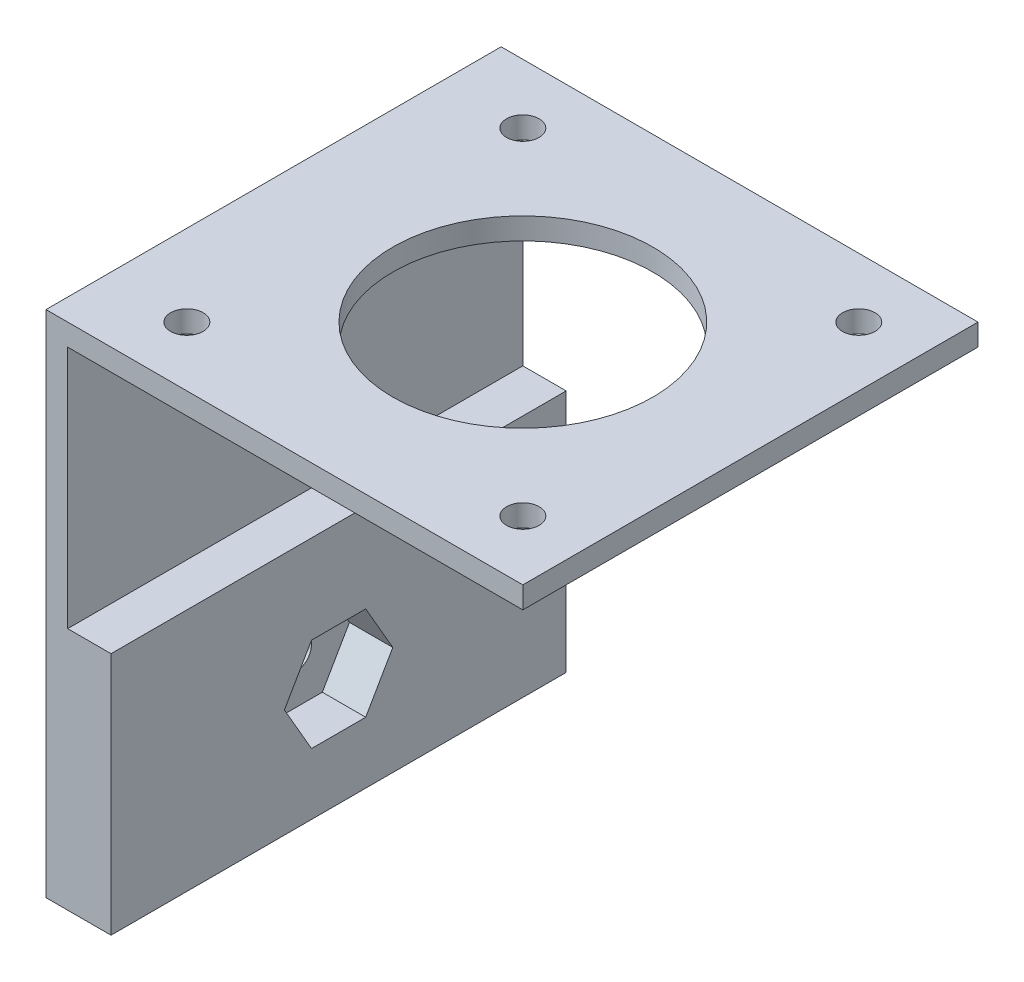
ISO-10303-21;
HEADER;
FILE_DESCRIPTION(('STEP AP214'),'2;1');
FILE_NAME('part.step','',(''),(''),'','','');
FILE_SCHEMA(('AUTOMOTIVE_DESIGN { 1 0 10303 214 1 1 1 1 }'));
ENDSEC;
DATA;
#1=APPLICATION_CONTEXT('core data for automotive mechanical design processes');
#2=APPLICATION_PROTOCOL_DEFINITION('international standard','automotive_design',2000,#1);
#3=PRODUCT_CONTEXT('',#1,'mechanical');
#4=PRODUCT('Part','Part','',(#3));
#5=PRODUCT_RELATED_PRODUCT_CATEGORY('part','',(#4));
#6=PRODUCT_DEFINITION_FORMATION('','',#4);
#7=PRODUCT_DEFINITION_CONTEXT('part definition',#1,'design');
#8=PRODUCT_DEFINITION('design','',#6,#7);
#9=PRODUCT_DEFINITION_SHAPE('','',#8);
#10=(LENGTH_UNIT() NAMED_UNIT(*) SI_UNIT(.MILLI.,.METRE.));
#11=(NAMED_UNIT(*) PLANE_ANGLE_UNIT() SI_UNIT($,.RADIAN.));
#12=(NAMED_UNIT(*) SI_UNIT($,.STERADIAN.) SOLID_ANGLE_UNIT());
#13=UNCERTAINTY_MEASURE_WITH_UNIT(LENGTH_MEASURE(1.E-05),#10,'distance_accuracy_value','');
#14=(GEOMETRIC_REPRESENTATION_CONTEXT(3) GLOBAL_UNCERTAINTY_ASSIGNED_CONTEXT((#13)) GLOBAL_UNIT_ASSIGNED_CONTEXT((#10,
#11,#12)) REPRESENTATION_CONTEXT('',''));
#15=CARTESIAN_POINT('',(0.,0.,0.));
#16=DIRECTION('',(0.,0.,1.));
#17=DIRECTION('',(1.,0.,0.));
#18=AXIS2_PLACEMENT_3D('',#15,#16,#17);
#19=CARTESIAN_POINT('',(0.,-45.,0.));
#20=DIRECTION('',(-1.,0.,0.));
#21=DIRECTION('',(0.,0.,1.));
#22=AXIS2_PLACEMENT_3D('',#19,#20,#21);
#23=PLANE('',#22);
#24=DIRECTION('',(0.,0.,1.));
#25=VECTOR('',#24,1.);
#26=CARTESIAN_POINT('',(0.,-22.5,0.));
#27=LINE('',#26,#25);
#28=CARTESIAN_POINT('',(0.,-22.5,-42.));
#29=VERTEX_POINT('',#28);
#30=CARTESIAN_POINT('',(0.,-22.5,0.));
#31=VERTEX_POINT('',#30);
#32=EDGE_CURVE('E209',#29,#31,#27,.T.);
#33=ORIENTED_EDGE('',*,*,#32,.F.);
#34=DIRECTION('',(0.,1.,0.));
#35=VECTOR('',#34,1.);
#36=CARTESIAN_POINT('',(0.,-45.,-42.));
#37=LINE('',#36,#35);
#38=CARTESIAN_POINT('',(0.,0.,-42.));
#39=VERTEX_POINT('',#38);
#40=EDGE_CURVE('E66',#29,#39,#37,.T.);
#41=ORIENTED_EDGE('',*,*,#40,.T.);
#42=DIRECTION('',(0.,0.,1.));
#43=VECTOR('',#42,1.);
#44=CARTESIAN_POINT('',(0.,0.,0.));
#45=LINE('',#44,#43);
#46=CARTESIAN_POINT('',(0.,0.,0.));
#47=VERTEX_POINT('',#46);
#48=EDGE_CURVE('E245',#39,#47,#45,.T.);
#49=ORIENTED_EDGE('',*,*,#48,.T.);
#50=DIRECTION('',(0.,1.,0.));
#51=VECTOR('',#50,1.);
#52=CARTESIAN_POINT('',(0.,-45.,0.));
#53=LINE('',#52,#51);
#54=EDGE_CURVE('E257',#31,#47,#53,.T.);
#55=ORIENTED_EDGE('',*,*,#54,.F.);
#56=EDGE_LOOP('',(#33,#41,#49,#55));
#57=FACE_BOUND('',#56,.T.);
#58=ADVANCED_FACE('F41',(#57),#23,.F.);
#59=CARTESIAN_POINT('',(0.,2.,0.));
#60=DIRECTION('',(0.,0.,-1.));
#61=DIRECTION('',(-1.,0.,0.));
#62=AXIS2_PLACEMENT_3D('',#59,#60,#61);
#63=PLANE('',#62);
#64=DIRECTION('',(0.,1.,0.));
#65=VECTOR('',#64,1.);
#66=CARTESIAN_POINT('',(-2.,2.,0.));
#67=LINE('',#66,#65);
#68=CARTESIAN_POINT('',(-2.,-45.,0.));
#69=VERTEX_POINT('',#68);
#70=CARTESIAN_POINT('',(-2.,2.,0.));
#71=VERTEX_POINT('',#70);
#72=EDGE_CURVE('E267',#69,#71,#67,.T.);
#73=ORIENTED_EDGE('',*,*,#72,.F.);
#74=DIRECTION('',(-1.,0.,0.));
#75=VECTOR('',#74,1.);
#76=CARTESIAN_POINT('',(-2.,-45.,0.));
#77=LINE('',#76,#75);
#78=CARTESIAN_POINT('',(4.,-45.,0.));
#79=VERTEX_POINT('',#78);
#80=EDGE_CURVE('E253',#79,#69,#77,.T.);
#81=ORIENTED_EDGE('',*,*,#80,.F.);
#82=DIRECTION('',(0.,-1.,0.));
#83=VECTOR('',#82,1.);
#84=CARTESIAN_POINT('',(4.,0.,0.));
#85=LINE('',#84,#83);
#86=CARTESIAN_POINT('',(4.,-22.5,0.));
#87=VERTEX_POINT('',#86);
#88=EDGE_CURVE('E228',#87,#79,#85,.T.);
#89=ORIENTED_EDGE('',*,*,#88,.F.);
#90=DIRECTION('',(-1.,0.,0.));
#91=VECTOR('',#90,1.);
#92=CARTESIAN_POINT('',(4.,-22.5,0.));
#93=LINE('',#92,#91);
#94=EDGE_CURVE('E236',#87,#31,#93,.T.);
#95=ORIENTED_EDGE('',*,*,#94,.T.);
#96=ORIENTED_EDGE('',*,*,#54,.T.);
#97=DIRECTION('',(1.,0.,0.));
#98=VECTOR('',#97,1.);
#99=CARTESIAN_POINT('',(0.,0.,0.));
#100=LINE('',#99,#98);
#101=CARTESIAN_POINT('',(42.,0.,0.));
#102=VERTEX_POINT('',#101);
#103=EDGE_CURVE('E312',#47,#102,#100,.T.);
#104=ORIENTED_EDGE('',*,*,#103,.T.);
#105=DIRECTION('',(0.,-1.,0.));
#106=VECTOR('',#105,1.);
#107=CARTESIAN_POINT('',(42.,2.,0.));
#108=LINE('',#107,#106);
#109=CARTESIAN_POINT('',(42.,2.,0.));
#110=VERTEX_POINT('',#109);
#111=EDGE_CURVE('E11',#110,#102,#108,.T.);
#112=ORIENTED_EDGE('',*,*,#111,.F.);
#113=DIRECTION('',(1.,0.,0.));
#114=VECTOR('',#113,1.);
#115=CARTESIAN_POINT('',(0.,2.,0.));
#116=LINE('',#115,#114);
#117=EDGE_CURVE('E316',#71,#110,#116,.T.);
#118=ORIENTED_EDGE('',*,*,#117,.F.);
#119=EDGE_LOOP('',(#73,#81,#89,#95,#96,#104,#112,#118));
#120=FACE_BOUND('',#119,.T.);
#121=ADVANCED_FACE('F43',(#120),#63,.F.);
#122=CARTESIAN_POINT('',(42.,2.,0.));
#123=DIRECTION('',(-1.,0.,0.));
#124=DIRECTION('',(0.,0.,1.));
#125=AXIS2_PLACEMENT_3D('',#122,#123,#124);
#126=PLANE('',#125);
#127=DIRECTION('',(0.,0.,-1.));
#128=VECTOR('',#127,1.);
#129=CARTESIAN_POINT('',(42.,0.,0.));
#130=LINE('',#129,#128);
#131=CARTESIAN_POINT('',(42.,0.,-42.));
#132=VERTEX_POINT('',#131);
#133=EDGE_CURVE('E328',#102,#132,#130,.T.);
#134=ORIENTED_EDGE('',*,*,#133,.T.);
#135=DIRECTION('',(0.,-1.,0.));
#136=VECTOR('',#135,1.);
#137=CARTESIAN_POINT('',(42.,2.,-42.));
#138=LINE('',#137,#136);
#139=CARTESIAN_POINT('',(42.,2.,-42.));
#140=VERTEX_POINT('',#139);
#141=EDGE_CURVE('E51',#140,#132,#138,.T.);
#142=ORIENTED_EDGE('',*,*,#141,.F.);
#143=DIRECTION('',(0.,0.,-1.));
#144=VECTOR('',#143,1.);
#145=CARTESIAN_POINT('',(42.,2.,0.));
#146=LINE('',#145,#144);
#147=EDGE_CURVE('E319',#110,#140,#146,.T.);
#148=ORIENTED_EDGE('',*,*,#147,.F.);
#149=ORIENTED_EDGE('',*,*,#111,.T.);
#150=EDGE_LOOP('',(#134,#142,#148,#149));
#151=FACE_BOUND('',#150,.T.);
#152=ADVANCED_FACE('F370',(#151),#126,.F.);
#153=CARTESIAN_POINT('',(0.,2.,-42.));
#154=DIRECTION('',(0.,0.,1.));
#155=DIRECTION('',(1.,0.,0.));
#156=AXIS2_PLACEMENT_3D('',#153,#154,#155);
#157=PLANE('',#156);
#158=DIRECTION('',(-1.,0.,0.));
#159=VECTOR('',#158,1.);
#160=CARTESIAN_POINT('',(0.,0.,-42.));
#161=LINE('',#160,#159);
#162=EDGE_CURVE('E320',#132,#39,#161,.T.);
#163=ORIENTED_EDGE('',*,*,#162,.T.);
#164=ORIENTED_EDGE('',*,*,#40,.F.);
#165=DIRECTION('',(-1.,0.,0.));
#166=VECTOR('',#165,1.);
#167=CARTESIAN_POINT('',(4.,-22.5,-42.));
#168=LINE('',#167,#166);
#169=CARTESIAN_POINT('',(4.,-22.5,-42.));
#170=VERTEX_POINT('',#169);
#171=EDGE_CURVE('E242',#170,#29,#168,.T.);
#172=ORIENTED_EDGE('',*,*,#171,.F.);
#173=DIRECTION('',(0.,1.,0.));
#174=VECTOR('',#173,1.);
#175=CARTESIAN_POINT('',(4.,0.,-42.));
#176=LINE('',#175,#174);
#177=CARTESIAN_POINT('',(4.,-45.,-42.));
#178=VERTEX_POINT('',#177);
#179=EDGE_CURVE('E221',#178,#170,#176,.T.);
#180=ORIENTED_EDGE('',*,*,#179,.F.);
#181=DIRECTION('',(1.,0.,0.));
#182=VECTOR('',#181,1.);
#183=CARTESIAN_POINT('',(0.,-45.,-42.));
#184=LINE('',#183,#182);
#185=CARTESIAN_POINT('',(-2.,-45.,-42.));
#186=VERTEX_POINT('',#185);
#187=EDGE_CURVE('E250',#186,#178,#184,.T.);
#188=ORIENTED_EDGE('',*,*,#187,.F.);
#189=DIRECTION('',(0.,-1.,0.));
#190=VECTOR('',#189,1.);
#191=CARTESIAN_POINT('',(-2.,0.,-42.));
#192=LINE('',#191,#190);
#193=CARTESIAN_POINT('',(-2.,2.,-42.));
#194=VERTEX_POINT('',#193);
#195=EDGE_CURVE('E264',#194,#186,#192,.T.);
#196=ORIENTED_EDGE('',*,*,#195,.F.);
#197=DIRECTION('',(-1.,0.,0.));
#198=VECTOR('',#197,1.);
#199=CARTESIAN_POINT('',(0.,2.,-42.));
#200=LINE('',#199,#198);
#201=EDGE_CURVE('E323',#140,#194,#200,.T.);
#202=ORIENTED_EDGE('',*,*,#201,.F.);
#203=ORIENTED_EDGE('',*,*,#141,.T.);
#204=EDGE_LOOP('',(#163,#164,#172,#180,#188,#196,#202,#203));
#205=FACE_BOUND('',#204,.T.);
#206=ADVANCED_FACE('F340',(#205),#157,.F.);
#207=CARTESIAN_POINT('',(0.,2.,0.));
#208=DIRECTION('',(0.,-1.,0.));
#209=DIRECTION('',(0.,0.,-1.));
#210=AXIS2_PLACEMENT_3D('',#207,#208,#209);
#211=PLANE('',#210);
#212=CARTESIAN_POINT('',(5.5,2.,-36.5));
#213=DIRECTION('',(0.,1.,0.));
#214=DIRECTION('',(0.,0.,1.));
#215=AXIS2_PLACEMENT_3D('',#212,#213,#214);
#216=CIRCLE('',#215,1.5);
#217=CARTESIAN_POINT('',(5.5,2.,-35.));
#218=VERTEX_POINT('',#217);
#219=EDGE_CURVE('E275',#218,#218,#216,.T.);
#220=ORIENTED_EDGE('',*,*,#219,.F.);
#221=EDGE_LOOP('',(#220));
#222=FACE_BOUND('',#221,.T.);
#223=CARTESIAN_POINT('',(5.5,2.,-5.5));
#224=DIRECTION('',(0.,1.,0.));
#225=DIRECTION('',(0.,0.,1.));
#226=AXIS2_PLACEMENT_3D('',#223,#224,#225);
#227=CIRCLE('',#226,1.5);
#228=CARTESIAN_POINT('',(5.5,2.,-4.));
#229=VERTEX_POINT('',#228);
#230=EDGE_CURVE('E297',#229,#229,#227,.T.);
#231=ORIENTED_EDGE('',*,*,#230,.F.);
#232=EDGE_LOOP('',(#231));
#233=FACE_BOUND('',#232,.T.);
#234=CARTESIAN_POINT('',(36.5,2.,-5.50000000000001));
#235=DIRECTION('',(0.,1.,0.));
#236=DIRECTION('',(0.,0.,1.));
#237=AXIS2_PLACEMENT_3D('',#234,#235,#236);
#238=CIRCLE('',#237,1.5);
#239=CARTESIAN_POINT('',(36.5,2.,-4.));
#240=VERTEX_POINT('',#239);
#241=EDGE_CURVE('E289',#240,#240,#238,.T.);
#242=ORIENTED_EDGE('',*,*,#241,.F.);
#243=EDGE_LOOP('',(#242));
#244=FACE_BOUND('',#243,.T.);
#245=CARTESIAN_POINT('',(36.5,2.,-36.5));
#246=DIRECTION('',(0.,1.,0.));
#247=DIRECTION('',(0.,0.,1.));
#248=AXIS2_PLACEMENT_3D('',#245,#246,#247);
#249=CIRCLE('',#248,1.5);
#250=CARTESIAN_POINT('',(36.5,2.,-35.));
#251=VERTEX_POINT('',#250);
#252=EDGE_CURVE('E281',#251,#251,#249,.T.);
#253=ORIENTED_EDGE('',*,*,#252,.F.);
#254=EDGE_LOOP('',(#253));
#255=FACE_BOUND('',#254,.T.);
#256=CARTESIAN_POINT('',(21.,2.,-21.));
#257=DIRECTION('',(0.,1.,0.));
#258=DIRECTION('',(0.,0.,1.));
#259=AXIS2_PLACEMENT_3D('',#256,#257,#258);
#260=CIRCLE('',#259,12.);
#261=CARTESIAN_POINT('',(21.,2.,-9.00000000000001));
#262=VERTEX_POINT('',#261);
#263=EDGE_CURVE('E280',#262,#262,#260,.T.);
#264=ORIENTED_EDGE('',*,*,#263,.F.);
#265=EDGE_LOOP('',(#264));
#266=FACE_BOUND('',#265,.T.);
#267=ORIENTED_EDGE('',*,*,#201,.T.);
#268=DIRECTION('',(0.,0.,-1.));
#269=VECTOR('',#268,1.);
#270=CARTESIAN_POINT('',(-2.,2.,-42.));
#271=LINE('',#270,#269);
#272=EDGE_CURVE('E271',#71,#194,#271,.T.);
#273=ORIENTED_EDGE('',*,*,#272,.F.);
#274=ORIENTED_EDGE('',*,*,#117,.T.);
#275=ORIENTED_EDGE('',*,*,#147,.T.);
#276=EDGE_LOOP('',(#267,#273,#274,#275));
#277=FACE_BOUND('',#276,.T.);
#278=ADVANCED_FACE('F369',(#222,#233,#244,#255,#266,#277),#211,.F.);
#279=CARTESIAN_POINT('',(0.,0.,0.));
#280=DIRECTION('',(0.,-1.,0.));
#281=DIRECTION('',(0.,0.,-1.));
#282=AXIS2_PLACEMENT_3D('',#279,#280,#281);
#283=PLANE('',#282);
#284=ORIENTED_EDGE('',*,*,#48,.F.);
#285=ORIENTED_EDGE('',*,*,#162,.F.);
#286=ORIENTED_EDGE('',*,*,#133,.F.);
#287=ORIENTED_EDGE('',*,*,#103,.F.);
#288=EDGE_LOOP('',(#284,#285,#286,#287));
#289=FACE_BOUND('',#288,.T.);
#290=CARTESIAN_POINT('',(5.5,0.,-36.5));
#291=DIRECTION('',(0.,1.,0.));
#292=DIRECTION('',(0.,0.,1.));
#293=AXIS2_PLACEMENT_3D('',#290,#291,#292);
#294=CIRCLE('',#293,1.5);
#295=CARTESIAN_POINT('',(5.5,0.,-35.));
#296=VERTEX_POINT('',#295);
#297=EDGE_CURVE('E301',#296,#296,#294,.T.);
#298=ORIENTED_EDGE('',*,*,#297,.T.);
#299=EDGE_LOOP('',(#298));
#300=FACE_BOUND('',#299,.T.);
#301=CARTESIAN_POINT('',(5.5,0.,-5.5));
#302=DIRECTION('',(0.,1.,0.));
#303=DIRECTION('',(0.,0.,1.));
#304=AXIS2_PLACEMENT_3D('',#301,#302,#303);
#305=CIRCLE('',#304,1.5);
#306=CARTESIAN_POINT('',(5.5,0.,-4.));
#307=VERTEX_POINT('',#306);
#308=EDGE_CURVE('E293',#307,#307,#305,.T.);
#309=ORIENTED_EDGE('',*,*,#308,.T.);
#310=EDGE_LOOP('',(#309));
#311=FACE_BOUND('',#310,.T.);
#312=CARTESIAN_POINT('',(36.5,0.,-5.50000000000001));
#313=DIRECTION('',(0.,1.,0.));
#314=DIRECTION('',(0.,0.,1.));
#315=AXIS2_PLACEMENT_3D('',#312,#313,#314);
#316=CIRCLE('',#315,1.5);
#317=CARTESIAN_POINT('',(36.5,0.,-4.));
#318=VERTEX_POINT('',#317);
#319=EDGE_CURVE('E285',#318,#318,#316,.T.);
#320=ORIENTED_EDGE('',*,*,#319,.T.);
#321=EDGE_LOOP('',(#320));
#322=FACE_BOUND('',#321,.T.);
#323=CARTESIAN_POINT('',(36.5,0.,-36.5));
#324=DIRECTION('',(0.,1.,0.));
#325=DIRECTION('',(0.,0.,1.));
#326=AXIS2_PLACEMENT_3D('',#323,#324,#325);
#327=CIRCLE('',#326,1.5);
#328=CARTESIAN_POINT('',(36.5,0.,-35.));
#329=VERTEX_POINT('',#328);
#330=EDGE_CURVE('E276',#329,#329,#327,.T.);
#331=ORIENTED_EDGE('',*,*,#330,.T.);
#332=EDGE_LOOP('',(#331));
#333=FACE_BOUND('',#332,.T.);
#334=CARTESIAN_POINT('',(21.,0.,-21.));
#335=DIRECTION('',(0.,1.,0.));
#336=DIRECTION('',(0.,0.,1.));
#337=AXIS2_PLACEMENT_3D('',#334,#335,#336);
#338=CIRCLE('',#337,12.);
#339=CARTESIAN_POINT('',(21.,0.,-9.00000000000001));
#340=VERTEX_POINT('',#339);
#341=EDGE_CURVE('E308',#340,#340,#338,.T.);
#342=ORIENTED_EDGE('',*,*,#341,.T.);
#343=EDGE_LOOP('',(#342));
#344=FACE_BOUND('',#343,.T.);
#345=ADVANCED_FACE('F346',(#289,#300,#311,#322,#333,#344),#283,.T.);
#346=CARTESIAN_POINT('',(21.,0.,-21.));
#347=DIRECTION('',(0.,1.,0.));
#348=DIRECTION('',(0.,0.,1.));
#349=AXIS2_PLACEMENT_3D('',#346,#347,#348);
#350=CYLINDRICAL_SURFACE('',#349,12.);
#351=ORIENTED_EDGE('',*,*,#341,.F.);
#352=EDGE_LOOP('',(#351));
#353=FACE_BOUND('',#352,.T.);
#354=ORIENTED_EDGE('',*,*,#263,.T.);
#355=EDGE_LOOP('',(#354));
#356=FACE_BOUND('',#355,.T.);
#357=ADVANCED_FACE('F392',(#353,#356),#350,.F.);
#358=CARTESIAN_POINT('',(36.5,0.,-36.5));
#359=DIRECTION('',(0.,1.,0.));
#360=DIRECTION('',(0.,0.,1.));
#361=AXIS2_PLACEMENT_3D('',#358,#359,#360);
#362=CYLINDRICAL_SURFACE('',#361,1.5);
#363=ORIENTED_EDGE('',*,*,#330,.F.);
#364=EDGE_LOOP('',(#363));
#365=FACE_BOUND('',#364,.T.);
#366=ORIENTED_EDGE('',*,*,#252,.T.);
#367=EDGE_LOOP('',(#366));
#368=FACE_BOUND('',#367,.T.);
#369=ADVANCED_FACE('F388',(#365,#368),#362,.F.);
#370=CARTESIAN_POINT('',(36.5,0.,-5.50000000000001));
#371=DIRECTION('',(0.,1.,0.));
#372=DIRECTION('',(0.,0.,1.));
#373=AXIS2_PLACEMENT_3D('',#370,#371,#372);
#374=CYLINDRICAL_SURFACE('',#373,1.5);
#375=ORIENTED_EDGE('',*,*,#319,.F.);
#376=EDGE_LOOP('',(#375));
#377=FACE_BOUND('',#376,.T.);
#378=ORIENTED_EDGE('',*,*,#241,.T.);
#379=EDGE_LOOP('',(#378));
#380=FACE_BOUND('',#379,.T.);
#381=ADVANCED_FACE('F391',(#377,#380),#374,.F.);
#382=CARTESIAN_POINT('',(5.5,0.,-5.5));
#383=DIRECTION('',(0.,1.,0.));
#384=DIRECTION('',(0.,0.,1.));
#385=AXIS2_PLACEMENT_3D('',#382,#383,#384);
#386=CYLINDRICAL_SURFACE('',#385,1.5);
#387=ORIENTED_EDGE('',*,*,#308,.F.);
#388=EDGE_LOOP('',(#387));
#389=FACE_BOUND('',#388,.T.);
#390=ORIENTED_EDGE('',*,*,#230,.T.);
#391=EDGE_LOOP('',(#390));
#392=FACE_BOUND('',#391,.T.);
#393=ADVANCED_FACE('F396',(#389,#392),#386,.F.);
#394=CARTESIAN_POINT('',(5.5,0.,-36.5));
#395=DIRECTION('',(0.,1.,0.));
#396=DIRECTION('',(0.,0.,1.));
#397=AXIS2_PLACEMENT_3D('',#394,#395,#396);
#398=CYLINDRICAL_SURFACE('',#397,1.5);
#399=ORIENTED_EDGE('',*,*,#297,.F.);
#400=EDGE_LOOP('',(#399));
#401=FACE_BOUND('',#400,.T.);
#402=ORIENTED_EDGE('',*,*,#219,.T.);
#403=EDGE_LOOP('',(#402));
#404=FACE_BOUND('',#403,.T.);
#405=ADVANCED_FACE('F386',(#401,#404),#398,.F.);
#406=CARTESIAN_POINT('',(-2.,0.,0.));
#407=DIRECTION('',(1.,0.,0.));
#408=DIRECTION('',(0.,0.,-1.));
#409=AXIS2_PLACEMENT_3D('',#406,#407,#408);
#410=PLANE('',#409);
#411=CARTESIAN_POINT('',(-2.,-35.,-21.));
#412=DIRECTION('',(1.,0.,0.));
#413=DIRECTION('',(0.,0.,-1.));
#414=AXIS2_PLACEMENT_3D('',#411,#412,#413);
#415=CIRCLE('',#414,1.5);
#416=CARTESIAN_POINT('',(-2.,-35.,-22.5));
#417=VERTEX_POINT('',#416);
#418=EDGE_CURVE('E45',#417,#417,#415,.T.);
#419=ORIENTED_EDGE('',*,*,#418,.T.);
#420=EDGE_LOOP('',(#419));
#421=FACE_BOUND('',#420,.T.);
#422=ORIENTED_EDGE('',*,*,#195,.T.);
#423=DIRECTION('',(0.,0.,-1.));
#424=VECTOR('',#423,1.);
#425=CARTESIAN_POINT('',(-2.,-45.,-42.));
#426=LINE('',#425,#424);
#427=EDGE_CURVE('E246',#69,#186,#426,.T.);
#428=ORIENTED_EDGE('',*,*,#427,.F.);
#429=ORIENTED_EDGE('',*,*,#72,.T.);
#430=ORIENTED_EDGE('',*,*,#272,.T.);
#431=EDGE_LOOP('',(#422,#428,#429,#430));
#432=FACE_BOUND('',#431,.T.);
#433=ADVANCED_FACE('F366',(#421,#432),#410,.F.);
#434=CARTESIAN_POINT('',(0.,-45.,0.));
#435=DIRECTION('',(0.,1.,0.));
#436=DIRECTION('',(0.,0.,1.));
#437=AXIS2_PLACEMENT_3D('',#434,#435,#436);
#438=PLANE('',#437);
#439=ORIENTED_EDGE('',*,*,#427,.T.);
#440=ORIENTED_EDGE('',*,*,#187,.T.);
#441=DIRECTION('',(0.,0.,-1.));
#442=VECTOR('',#441,1.);
#443=CARTESIAN_POINT('',(4.,-45.,0.));
#444=LINE('',#443,#442);
#445=EDGE_CURVE('E232',#79,#178,#444,.T.);
#446=ORIENTED_EDGE('',*,*,#445,.F.);
#447=ORIENTED_EDGE('',*,*,#80,.T.);
#448=EDGE_LOOP('',(#439,#440,#446,#447));
#449=FACE_BOUND('',#448,.T.);
#450=ADVANCED_FACE('F363',(#449),#438,.F.);
#451=CARTESIAN_POINT('',(4.,-22.5,0.));
#452=DIRECTION('',(0.,-1.,0.));
#453=DIRECTION('',(0.,0.,-1.));
#454=AXIS2_PLACEMENT_3D('',#451,#452,#453);
#455=PLANE('',#454);
#456=ORIENTED_EDGE('',*,*,#32,.T.);
#457=ORIENTED_EDGE('',*,*,#94,.F.);
#458=DIRECTION('',(0.,0.,1.));
#459=VECTOR('',#458,1.);
#460=CARTESIAN_POINT('',(4.,-22.5,0.));
#461=LINE('',#460,#459);
#462=EDGE_CURVE('E225',#170,#87,#461,.T.);
#463=ORIENTED_EDGE('',*,*,#462,.F.);
#464=ORIENTED_EDGE('',*,*,#171,.T.);
#465=EDGE_LOOP('',(#456,#457,#463,#464));
#466=FACE_BOUND('',#465,.T.);
#467=ADVANCED_FACE('F355',(#466),#455,.F.);
#468=CARTESIAN_POINT('',(4.,0.,0.));
#469=DIRECTION('',(1.,0.,0.));
#470=DIRECTION('',(0.,0.,-1.));
#471=AXIS2_PLACEMENT_3D('',#468,#469,#470);
#472=PLANE('',#471);
#473=DIRECTION('',(0.,0.,-1.));
#474=VECTOR('',#473,1.);
#475=CARTESIAN_POINT('',(4.,-39.3301270189222,0.));
#476=LINE('',#475,#474);
#477=CARTESIAN_POINT('',(4.,-39.3301270189222,-18.5));
#478=VERTEX_POINT('',#477);
#479=CARTESIAN_POINT('',(4.,-39.3301270189222,-23.5));
#480=VERTEX_POINT('',#479);
#481=EDGE_CURVE('E58',#478,#480,#476,.T.);
#482=ORIENTED_EDGE('',*,*,#481,.F.);
#483=DIRECTION('',(0.,-0.866025403784439,-0.5));
#484=VECTOR('',#483,1.);
#485=CARTESIAN_POINT('',(4.,-1.82179676972448,3.15544456622767));
#486=LINE('',#485,#484);
#487=CARTESIAN_POINT('',(4.,-35.,-16.));
#488=VERTEX_POINT('',#487);
#489=EDGE_CURVE('E170',#488,#478,#486,.T.);
#490=ORIENTED_EDGE('',*,*,#489,.F.);
#491=DIRECTION('',(0.,-0.866025403784439,0.5));
#492=VECTOR('',#491,1.);
#493=CARTESIAN_POINT('',(4.,-15.6782032302755,-27.1554445662277));
#494=LINE('',#493,#492);
#495=CARTESIAN_POINT('',(4.,-30.6698729810778,-18.5));
#496=VERTEX_POINT('',#495);
#497=EDGE_CURVE('E174',#496,#488,#494,.T.);
#498=ORIENTED_EDGE('',*,*,#497,.F.);
#499=DIRECTION('',(0.,0.,1.));
#500=VECTOR('',#499,1.);
#501=CARTESIAN_POINT('',(4.,-30.6698729810778,0.));
#502=LINE('',#501,#500);
#503=CARTESIAN_POINT('',(4.,-30.6698729810778,-23.5));
#504=VERTEX_POINT('',#503);
#505=EDGE_CURVE('E199',#504,#496,#502,.T.);
#506=ORIENTED_EDGE('',*,*,#505,.F.);
#507=DIRECTION('',(0.,0.866025403784439,0.499999999999999));
#508=VECTOR('',#507,1.);
#509=CARTESIAN_POINT('',(4.,2.50833024919773,-4.34455543377238));
#510=LINE('',#509,#508);
#511=CARTESIAN_POINT('',(4.,-35.,-26.));
#512=VERTEX_POINT('',#511);
#513=EDGE_CURVE('E195',#512,#504,#510,.T.);
#514=ORIENTED_EDGE('',*,*,#513,.F.);
#515=DIRECTION('',(0.,0.866025403784439,-0.5));
#516=VECTOR('',#515,1.);
#517=CARTESIAN_POINT('',(4.,-20.0083302491977,-34.6554445662277));
#518=LINE('',#517,#516);
#519=EDGE_CURVE('E192',#480,#512,#518,.T.);
#520=ORIENTED_EDGE('',*,*,#519,.F.);
#521=EDGE_LOOP('',(#482,#490,#498,#506,#514,#520));
#522=FACE_BOUND('',#521,.T.);
#523=ORIENTED_EDGE('',*,*,#179,.T.);
#524=ORIENTED_EDGE('',*,*,#462,.T.);
#525=ORIENTED_EDGE('',*,*,#88,.T.);
#526=ORIENTED_EDGE('',*,*,#445,.T.);
#527=EDGE_LOOP('',(#523,#524,#525,#526));
#528=FACE_BOUND('',#527,.T.);
#529=ADVANCED_FACE('F360',(#522,#528),#472,.T.);
#530=CARTESIAN_POINT('',(0.,-39.3301270189222,0.));
#531=DIRECTION('',(0.,-1.,0.));
#532=DIRECTION('',(0.,0.,-1.));
#533=AXIS2_PLACEMENT_3D('',#530,#531,#532);
#534=PLANE('',#533);
#535=ORIENTED_EDGE('',*,*,#481,.T.);
#536=DIRECTION('',(1.,0.,0.));
#537=VECTOR('',#536,1.);
#538=CARTESIAN_POINT('',(0.,-39.3301270189222,-23.5));
#539=LINE('',#538,#537);
#540=CARTESIAN_POINT('',(0.,-39.3301270189222,-23.5));
#541=VERTEX_POINT('',#540);
#542=EDGE_CURVE('E144',#541,#480,#539,.T.);
#543=ORIENTED_EDGE('',*,*,#542,.F.);
#544=DIRECTION('',(0.,0.,-1.));
#545=VECTOR('',#544,1.);
#546=CARTESIAN_POINT('',(0.,-39.3301270189222,0.));
#547=LINE('',#546,#545);
#548=CARTESIAN_POINT('',(0.,-39.3301270189222,-18.5));
#549=VERTEX_POINT('',#548);
#550=EDGE_CURVE('E148',#549,#541,#547,.T.);
#551=ORIENTED_EDGE('',*,*,#550,.F.);
#552=DIRECTION('',(1.,0.,0.));
#553=VECTOR('',#552,1.);
#554=CARTESIAN_POINT('',(0.,-39.3301270189222,-18.5));
#555=LINE('',#554,#553);
#556=EDGE_CURVE('E206',#549,#478,#555,.T.);
#557=ORIENTED_EDGE('',*,*,#556,.T.);
#558=EDGE_LOOP('',(#535,#543,#551,#557));
#559=FACE_BOUND('',#558,.T.);
#560=ADVANCED_FACE('F146',(#559),#534,.F.);
#561=CARTESIAN_POINT('',(0.,-1.82179676972448,3.15544456622767));
#562=DIRECTION('',(0.,-0.5,0.866025403784439));
#563=DIRECTION('',(0.,-0.866025403784439,-0.5));
#564=AXIS2_PLACEMENT_3D('',#561,#562,#563);
#565=PLANE('',#564);
#566=ORIENTED_EDGE('',*,*,#489,.T.);
#567=ORIENTED_EDGE('',*,*,#556,.F.);
#568=DIRECTION('',(0.,-0.866025403784439,-0.5));
#569=VECTOR('',#568,1.);
#570=CARTESIAN_POINT('',(0.,-1.82179676972448,3.15544456622767));
#571=LINE('',#570,#569);
#572=CARTESIAN_POINT('',(0.,-35.,-16.));
#573=VERTEX_POINT('',#572);
#574=EDGE_CURVE('E155',#573,#549,#571,.T.);
#575=ORIENTED_EDGE('',*,*,#574,.F.);
#576=DIRECTION('',(1.,0.,0.));
#577=VECTOR('',#576,1.);
#578=CARTESIAN_POINT('',(0.,-35.,-16.));
#579=LINE('',#578,#577);
#580=EDGE_CURVE('E210',#573,#488,#579,.T.);
#581=ORIENTED_EDGE('',*,*,#580,.T.);
#582=EDGE_LOOP('',(#566,#567,#575,#581));
#583=FACE_BOUND('',#582,.T.);
#584=ADVANCED_FACE('F465',(#583),#565,.F.);
#585=CARTESIAN_POINT('',(0.,-15.6782032302755,-27.1554445662277));
#586=DIRECTION('',(0.,0.5,0.866025403784438));
#587=DIRECTION('',(0.,-0.866025403784439,0.5));
#588=AXIS2_PLACEMENT_3D('',#585,#586,#587);
#589=PLANE('',#588);
#590=ORIENTED_EDGE('',*,*,#497,.T.);
#591=ORIENTED_EDGE('',*,*,#580,.F.);
#592=DIRECTION('',(0.,-0.866025403784439,0.5));
#593=VECTOR('',#592,1.);
#594=CARTESIAN_POINT('',(0.,-15.6782032302755,-27.1554445662277));
#595=LINE('',#594,#593);
#596=CARTESIAN_POINT('',(0.,-30.6698729810778,-18.5));
#597=VERTEX_POINT('',#596);
#598=EDGE_CURVE('E185',#597,#573,#595,.T.);
#599=ORIENTED_EDGE('',*,*,#598,.F.);
#600=DIRECTION('',(1.,0.,0.));
#601=VECTOR('',#600,1.);
#602=CARTESIAN_POINT('',(0.,-30.6698729810778,-18.5));
#603=LINE('',#602,#601);
#604=EDGE_CURVE('E213',#597,#496,#603,.T.);
#605=ORIENTED_EDGE('',*,*,#604,.T.);
#606=EDGE_LOOP('',(#590,#591,#599,#605));
#607=FACE_BOUND('',#606,.T.);
#608=ADVANCED_FACE('F472',(#607),#589,.F.);
#609=CARTESIAN_POINT('',(0.,-30.6698729810778,0.));
#610=DIRECTION('',(0.,1.,0.));
#611=DIRECTION('',(0.,0.,1.));
#612=AXIS2_PLACEMENT_3D('',#609,#610,#611);
#613=PLANE('',#612);
#614=ORIENTED_EDGE('',*,*,#505,.T.);
#615=ORIENTED_EDGE('',*,*,#604,.F.);
#616=DIRECTION('',(0.,0.,1.));
#617=VECTOR('',#616,1.);
#618=CARTESIAN_POINT('',(0.,-30.6698729810778,0.));
#619=LINE('',#618,#617);
#620=CARTESIAN_POINT('',(0.,-30.6698729810778,-23.5));
#621=VERTEX_POINT('',#620);
#622=EDGE_CURVE('E181',#621,#597,#619,.T.);
#623=ORIENTED_EDGE('',*,*,#622,.F.);
#624=DIRECTION('',(1.,0.,0.));
#625=VECTOR('',#624,1.);
#626=CARTESIAN_POINT('',(0.,-30.6698729810778,-23.5));
#627=LINE('',#626,#625);
#628=EDGE_CURVE('E216',#621,#504,#627,.T.);
#629=ORIENTED_EDGE('',*,*,#628,.T.);
#630=EDGE_LOOP('',(#614,#615,#623,#629));
#631=FACE_BOUND('',#630,.T.);
#632=ADVANCED_FACE('F480',(#631),#613,.F.);
#633=CARTESIAN_POINT('',(0.,2.50833024919773,-4.34455543377238));
#634=DIRECTION('',(0.,0.499999999999999,-0.866025403784439));
#635=DIRECTION('',(0.,0.866025403784439,0.499999999999999));
#636=AXIS2_PLACEMENT_3D('',#633,#634,#635);
#637=PLANE('',#636);
#638=ORIENTED_EDGE('',*,*,#513,.T.);
#639=ORIENTED_EDGE('',*,*,#628,.F.);
#640=DIRECTION('',(0.,0.866025403784439,0.499999999999999));
#641=VECTOR('',#640,1.);
#642=CARTESIAN_POINT('',(0.,2.50833024919773,-4.34455543377238));
#643=LINE('',#642,#641);
#644=CARTESIAN_POINT('',(0.,-35.,-26.));
#645=VERTEX_POINT('',#644);
#646=EDGE_CURVE('E164',#645,#621,#643,.T.);
#647=ORIENTED_EDGE('',*,*,#646,.F.);
#648=DIRECTION('',(1.,0.,0.));
#649=VECTOR('',#648,1.);
#650=CARTESIAN_POINT('',(0.,-35.,-26.));
#651=LINE('',#650,#649);
#652=EDGE_CURVE('E154',#645,#512,#651,.T.);
#653=ORIENTED_EDGE('',*,*,#652,.T.);
#654=EDGE_LOOP('',(#638,#639,#647,#653));
#655=FACE_BOUND('',#654,.T.);
#656=ADVANCED_FACE('F488',(#655),#637,.F.);
#657=CARTESIAN_POINT('',(0.,-20.0083302491977,-34.6554445662277));
#658=DIRECTION('',(0.,-0.5,-0.866025403784439));
#659=DIRECTION('',(0.,0.866025403784439,-0.5));
#660=AXIS2_PLACEMENT_3D('',#657,#658,#659);
#661=PLANE('',#660);
#662=ORIENTED_EDGE('',*,*,#519,.T.);
#663=ORIENTED_EDGE('',*,*,#652,.F.);
#664=DIRECTION('',(0.,0.866025403784439,-0.5));
#665=VECTOR('',#664,1.);
#666=CARTESIAN_POINT('',(0.,-20.0083302491977,-34.6554445662277));
#667=LINE('',#666,#665);
#668=EDGE_CURVE('E158',#541,#645,#667,.T.);
#669=ORIENTED_EDGE('',*,*,#668,.F.);
#670=ORIENTED_EDGE('',*,*,#542,.T.);
#671=EDGE_LOOP('',(#662,#663,#669,#670));
#672=FACE_BOUND('',#671,.T.);
#673=ADVANCED_FACE('F159',(#672),#661,.F.);
#674=CARTESIAN_POINT('',(0.,0.,0.));
#675=DIRECTION('',(1.,0.,0.));
#676=DIRECTION('',(0.,0.,-1.));
#677=AXIS2_PLACEMENT_3D('',#674,#675,#676);
#678=PLANE('',#677);
#679=CARTESIAN_POINT('',(0.,-35.,-21.));
#680=DIRECTION('',(1.,0.,0.));
#681=DIRECTION('',(0.,0.,-1.));
#682=AXIS2_PLACEMENT_3D('',#679,#680,#681);
#683=CIRCLE('',#682,1.5);
#684=CARTESIAN_POINT('',(0.,-35.,-22.5));
#685=VERTEX_POINT('',#684);
#686=EDGE_CURVE('E177',#685,#685,#683,.T.);
#687=ORIENTED_EDGE('',*,*,#686,.F.);
#688=EDGE_LOOP('',(#687));
#689=FACE_BOUND('',#688,.T.);
#690=ORIENTED_EDGE('',*,*,#550,.T.);
#691=ORIENTED_EDGE('',*,*,#668,.T.);
#692=ORIENTED_EDGE('',*,*,#646,.T.);
#693=ORIENTED_EDGE('',*,*,#622,.T.);
#694=ORIENTED_EDGE('',*,*,#598,.T.);
#695=ORIENTED_EDGE('',*,*,#574,.T.);
#696=EDGE_LOOP('',(#690,#691,#692,#693,#694,#695));
#697=FACE_BOUND('',#696,.T.);
#698=ADVANCED_FACE('F166',(#689,#697),#678,.T.);
#699=CARTESIAN_POINT('',(-4.,-35.,-21.));
#700=DIRECTION('',(1.,0.,0.));
#701=DIRECTION('',(0.,0.,-1.));
#702=AXIS2_PLACEMENT_3D('',#699,#700,#701);
#703=CYLINDRICAL_SURFACE('',#702,1.5);
#704=ORIENTED_EDGE('',*,*,#686,.T.);
#705=EDGE_LOOP('',(#704));
#706=FACE_BOUND('',#705,.T.);
#707=ORIENTED_EDGE('',*,*,#418,.F.);
#708=EDGE_LOOP('',(#707));
#709=FACE_BOUND('',#708,.T.);
#710=ADVANCED_FACE('F507',(#706,#709),#703,.F.);
#711=CLOSED_SHELL('',(#58,#121,#152,#206,#278,#345,#357,#369,#381,#393,#405,#433,#450,#467,#529,
#560,#584,#608,#632,#656,#673,#698,#710));
#712=MANIFOLD_SOLID_BREP('B2',#711);
#713=ADVANCED_BREP_SHAPE_REPRESENTATION('',(#18,#712),#14);
#714=SHAPE_DEFINITION_REPRESENTATION(#9,#713);
ENDSEC;
END-ISO-10303-21;
